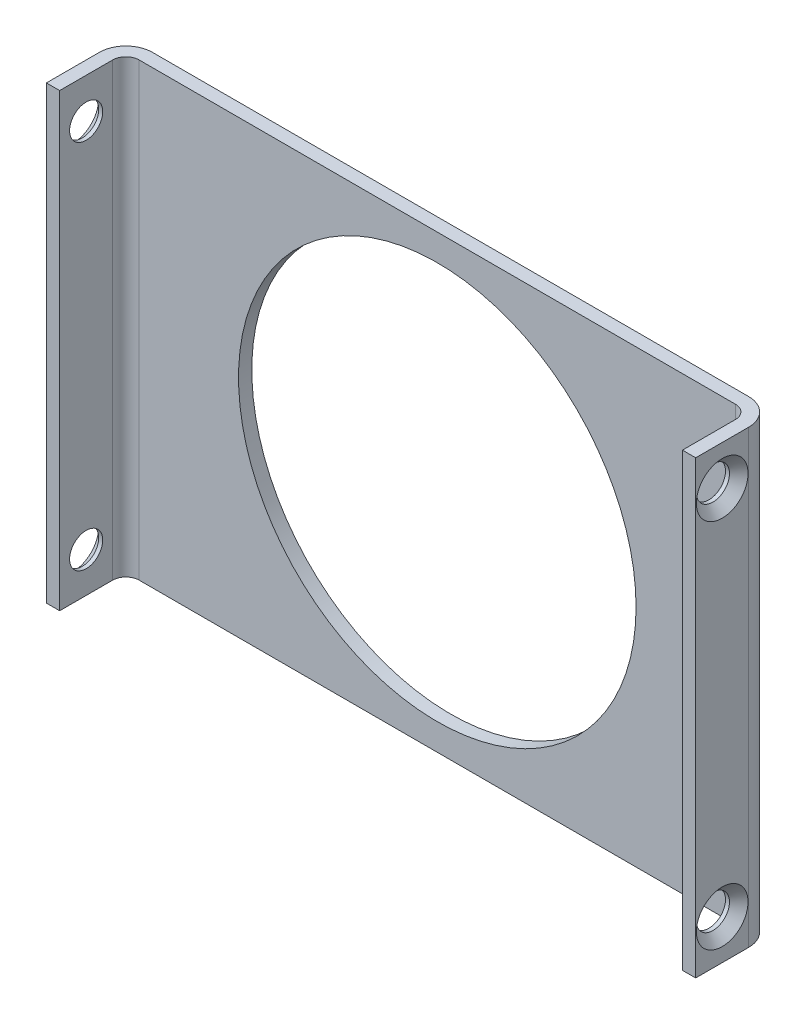
ISO-10303-21;
HEADER;
FILE_DESCRIPTION(('STEP AP214'),'2;1');
FILE_NAME('part.step','',(''),(''),'','','');
FILE_SCHEMA(('AUTOMOTIVE_DESIGN { 1 0 10303 214 1 1 1 1 }'));
ENDSEC;
DATA;
#1=APPLICATION_CONTEXT('core data for automotive mechanical design processes');
#2=APPLICATION_PROTOCOL_DEFINITION('international standard','automotive_design',2000,#1);
#3=PRODUCT_CONTEXT('',#1,'mechanical');
#4=PRODUCT('Part','Part','',(#3));
#5=PRODUCT_RELATED_PRODUCT_CATEGORY('part','',(#4));
#6=PRODUCT_DEFINITION_FORMATION('','',#4);
#7=PRODUCT_DEFINITION_CONTEXT('part definition',#1,'design');
#8=PRODUCT_DEFINITION('design','',#6,#7);
#9=PRODUCT_DEFINITION_SHAPE('','',#8);
#10=(LENGTH_UNIT() NAMED_UNIT(*) SI_UNIT(.MILLI.,.METRE.));
#11=(NAMED_UNIT(*) PLANE_ANGLE_UNIT() SI_UNIT($,.RADIAN.));
#12=(NAMED_UNIT(*) SI_UNIT($,.STERADIAN.) SOLID_ANGLE_UNIT());
#13=UNCERTAINTY_MEASURE_WITH_UNIT(LENGTH_MEASURE(1.E-05),#10,'distance_accuracy_value','');
#14=(GEOMETRIC_REPRESENTATION_CONTEXT(3) GLOBAL_UNCERTAINTY_ASSIGNED_CONTEXT((#13)) GLOBAL_UNIT_ASSIGNED_CONTEXT((#10,
#11,#12)) REPRESENTATION_CONTEXT('',''));
#15=CARTESIAN_POINT('',(0.,0.,0.));
#16=DIRECTION('',(0.,0.,1.));
#17=DIRECTION('',(1.,0.,0.));
#18=AXIS2_PLACEMENT_3D('',#15,#16,#17);
#19=CARTESIAN_POINT('',(0.,0.,2.));
#20=DIRECTION('',(-1.,0.,0.));
#21=DIRECTION('',(0.,-1.,0.));
#22=AXIS2_PLACEMENT_3D('',#19,#20,#21);
#23=PLANE('',#22);
#24=CARTESIAN_POINT('',(0.,62.,7.99999999999998));
#25=DIRECTION('',(-1.,0.,0.));
#26=DIRECTION('',(0.,0.,1.));
#27=AXIS2_PLACEMENT_3D('',#24,#25,#26);
#28=CIRCLE('',#27,3.9);
#29=CARTESIAN_POINT('',(0.,62.,11.9));
#30=VERTEX_POINT('',#29);
#31=EDGE_CURVE('E236',#30,#30,#28,.T.);
#32=ORIENTED_EDGE('',*,*,#31,.F.);
#33=EDGE_LOOP('',(#32));
#34=FACE_BOUND('',#33,.T.);
#35=DIRECTION('',(0.,0.,-1.));
#36=VECTOR('',#35,1.);
#37=CARTESIAN_POINT('',(0.,68.,2.));
#38=LINE('',#37,#36);
#39=CARTESIAN_POINT('',(0.,68.,12.));
#40=VERTEX_POINT('',#39);
#41=CARTESIAN_POINT('',(0.,68.,4.));
#42=VERTEX_POINT('',#41);
#43=EDGE_CURVE('E124',#40,#42,#38,.T.);
#44=ORIENTED_EDGE('',*,*,#43,.T.);
#45=DIRECTION('',(0.,1.,0.));
#46=VECTOR('',#45,1.);
#47=CARTESIAN_POINT('',(0.,68.,4.));
#48=LINE('',#47,#46);
#49=CARTESIAN_POINT('',(0.,0.,4.));
#50=VERTEX_POINT('',#49);
#51=EDGE_CURVE('E59',#42,#50,#48,.F.);
#52=ORIENTED_EDGE('',*,*,#51,.T.);
#53=DIRECTION('',(0.,0.,-1.));
#54=VECTOR('',#53,1.);
#55=CARTESIAN_POINT('',(0.,0.,2.));
#56=LINE('',#55,#54);
#57=CARTESIAN_POINT('',(0.,0.,12.));
#58=VERTEX_POINT('',#57);
#59=EDGE_CURVE('E144',#58,#50,#56,.T.);
#60=ORIENTED_EDGE('',*,*,#59,.F.);
#61=DIRECTION('',(0.,1.,0.));
#62=VECTOR('',#61,1.);
#63=CARTESIAN_POINT('',(0.,0.,12.));
#64=LINE('',#63,#62);
#65=EDGE_CURVE('E139',#58,#40,#64,.T.);
#66=ORIENTED_EDGE('',*,*,#65,.T.);
#67=EDGE_LOOP('',(#44,#52,#60,#66));
#68=FACE_BOUND('',#67,.T.);
#69=CARTESIAN_POINT('',(0.,6.,7.99999999999998));
#70=DIRECTION('',(-1.,0.,0.));
#71=DIRECTION('',(0.,0.,1.));
#72=AXIS2_PLACEMENT_3D('',#69,#70,#71);
#73=CIRCLE('',#72,3.9);
#74=CARTESIAN_POINT('',(0.,6.,11.9));
#75=VERTEX_POINT('',#74);
#76=EDGE_CURVE('E438',#75,#75,#73,.T.);
#77=ORIENTED_EDGE('',*,*,#76,.F.);
#78=EDGE_LOOP('',(#77));
#79=FACE_BOUND('',#78,.T.);
#80=ADVANCED_FACE('F35',(#34,#68,#79),#23,.T.);
#81=CARTESIAN_POINT('',(2.,68.,12.));
#82=DIRECTION('',(1.,0.,0.));
#83=DIRECTION('',(0.,0.,-1.));
#84=AXIS2_PLACEMENT_3D('',#81,#82,#83);
#85=PLANE('',#84);
#86=CARTESIAN_POINT('',(2.,62.,7.99999999999998));
#87=DIRECTION('',(1.,0.,0.));
#88=DIRECTION('',(0.,0.,-1.));
#89=AXIS2_PLACEMENT_3D('',#86,#87,#88);
#90=CIRCLE('',#89,2.5);
#91=CARTESIAN_POINT('',(2.,62.,5.49999999999998));
#92=VERTEX_POINT('',#91);
#93=EDGE_CURVE('E233',#92,#92,#90,.F.);
#94=ORIENTED_EDGE('',*,*,#93,.T.);
#95=EDGE_LOOP('',(#94));
#96=FACE_BOUND('',#95,.T.);
#97=DIRECTION('',(0.,0.,-1.));
#98=VECTOR('',#97,1.);
#99=CARTESIAN_POINT('',(2.,0.,12.));
#100=LINE('',#99,#98);
#101=CARTESIAN_POINT('',(2.,0.,12.));
#102=VERTEX_POINT('',#101);
#103=CARTESIAN_POINT('',(2.,0.,3.99999999999996));
#104=VERTEX_POINT('',#103);
#105=EDGE_CURVE('E158',#102,#104,#100,.T.);
#106=ORIENTED_EDGE('',*,*,#105,.T.);
#107=DIRECTION('',(0.,1.,0.));
#108=VECTOR('',#107,1.);
#109=CARTESIAN_POINT('',(2.,68.,3.99999999999996));
#110=LINE('',#109,#108);
#111=CARTESIAN_POINT('',(2.,68.,3.99999999999996));
#112=VERTEX_POINT('',#111);
#113=EDGE_CURVE('E195',#104,#112,#110,.T.);
#114=ORIENTED_EDGE('',*,*,#113,.T.);
#115=DIRECTION('',(0.,0.,-1.));
#116=VECTOR('',#115,1.);
#117=CARTESIAN_POINT('',(2.,68.,12.));
#118=LINE('',#117,#116);
#119=CARTESIAN_POINT('',(2.,68.,12.));
#120=VERTEX_POINT('',#119);
#121=EDGE_CURVE('E157',#120,#112,#118,.T.);
#122=ORIENTED_EDGE('',*,*,#121,.F.);
#123=DIRECTION('',(0.,-1.,0.));
#124=VECTOR('',#123,1.);
#125=CARTESIAN_POINT('',(2.,68.,12.));
#126=LINE('',#125,#124);
#127=EDGE_CURVE('E141',#120,#102,#126,.T.);
#128=ORIENTED_EDGE('',*,*,#127,.T.);
#129=EDGE_LOOP('',(#106,#114,#122,#128));
#130=FACE_BOUND('',#129,.T.);
#131=CARTESIAN_POINT('',(2.,6.,7.99999999999998));
#132=DIRECTION('',(1.,0.,0.));
#133=DIRECTION('',(0.,0.,-1.));
#134=AXIS2_PLACEMENT_3D('',#131,#132,#133);
#135=CIRCLE('',#134,2.5);
#136=CARTESIAN_POINT('',(2.,6.,5.49999999999998));
#137=VERTEX_POINT('',#136);
#138=EDGE_CURVE('E38',#137,#137,#135,.F.);
#139=ORIENTED_EDGE('',*,*,#138,.T.);
#140=EDGE_LOOP('',(#139));
#141=FACE_BOUND('',#140,.T.);
#142=ADVANCED_FACE('F274',(#96,#130,#141),#85,.T.);
#143=CARTESIAN_POINT('',(98.,68.,2.));
#144=DIRECTION('',(1.,0.,0.));
#145=DIRECTION('',(0.,1.,0.));
#146=AXIS2_PLACEMENT_3D('',#143,#144,#145);
#147=PLANE('',#146);
#148=CARTESIAN_POINT('',(98.,6.,7.99999999999998));
#149=DIRECTION('',(1.,0.,0.));
#150=DIRECTION('',(0.,0.,-1.));
#151=AXIS2_PLACEMENT_3D('',#148,#149,#150);
#152=CIRCLE('',#151,3.9);
#153=CARTESIAN_POINT('',(98.,6.,4.09999999999998));
#154=VERTEX_POINT('',#153);
#155=EDGE_CURVE('E231',#154,#154,#152,.T.);
#156=ORIENTED_EDGE('',*,*,#155,.F.);
#157=EDGE_LOOP('',(#156));
#158=FACE_BOUND('',#157,.T.);
#159=DIRECTION('',(0.,0.,-1.));
#160=VECTOR('',#159,1.);
#161=CARTESIAN_POINT('',(98.,0.,2.));
#162=LINE('',#161,#160);
#163=CARTESIAN_POINT('',(98.,0.,12.));
#164=VERTEX_POINT('',#163);
#165=CARTESIAN_POINT('',(98.,0.,4.));
#166=VERTEX_POINT('',#165);
#167=EDGE_CURVE('E196',#164,#166,#162,.T.);
#168=ORIENTED_EDGE('',*,*,#167,.T.);
#169=DIRECTION('',(0.,-1.,0.));
#170=VECTOR('',#169,1.);
#171=CARTESIAN_POINT('',(98.,68.,4.));
#172=LINE('',#171,#170);
#173=CARTESIAN_POINT('',(98.,68.,4.));
#174=VERTEX_POINT('',#173);
#175=EDGE_CURVE('E11',#166,#174,#172,.F.);
#176=ORIENTED_EDGE('',*,*,#175,.T.);
#177=DIRECTION('',(0.,0.,-1.));
#178=VECTOR('',#177,1.);
#179=CARTESIAN_POINT('',(98.,68.,2.));
#180=LINE('',#179,#178);
#181=CARTESIAN_POINT('',(98.,68.,12.));
#182=VERTEX_POINT('',#181);
#183=EDGE_CURVE('E133',#182,#174,#180,.T.);
#184=ORIENTED_EDGE('',*,*,#183,.F.);
#185=DIRECTION('',(0.,-1.,0.));
#186=VECTOR('',#185,1.);
#187=CARTESIAN_POINT('',(98.,68.,12.));
#188=LINE('',#187,#186);
#189=EDGE_CURVE('E161',#182,#164,#188,.T.);
#190=ORIENTED_EDGE('',*,*,#189,.T.);
#191=EDGE_LOOP('',(#168,#176,#184,#190));
#192=FACE_BOUND('',#191,.T.);
#193=CARTESIAN_POINT('',(98.,62.,7.99999999999998));
#194=DIRECTION('',(1.,0.,0.));
#195=DIRECTION('',(0.,0.,-1.));
#196=AXIS2_PLACEMENT_3D('',#193,#194,#195);
#197=CIRCLE('',#196,3.9);
#198=CARTESIAN_POINT('',(98.,62.,4.09999999999998));
#199=VERTEX_POINT('',#198);
#200=EDGE_CURVE('E235',#199,#199,#197,.T.);
#201=ORIENTED_EDGE('',*,*,#200,.F.);
#202=EDGE_LOOP('',(#201));
#203=FACE_BOUND('',#202,.T.);
#204=ADVANCED_FACE('F279',(#158,#192,#203),#147,.T.);
#205=CARTESIAN_POINT('',(96.,0.,12.));
#206=DIRECTION('',(-1.,0.,0.));
#207=DIRECTION('',(0.,0.,1.));
#208=AXIS2_PLACEMENT_3D('',#205,#206,#207);
#209=PLANE('',#208);
#210=CARTESIAN_POINT('',(96.,6.,7.99999999999998));
#211=DIRECTION('',(-1.,0.,0.));
#212=DIRECTION('',(0.,0.,1.));
#213=AXIS2_PLACEMENT_3D('',#210,#211,#212);
#214=CIRCLE('',#213,2.49999999999999);
#215=CARTESIAN_POINT('',(96.,6.,10.5));
#216=VERTEX_POINT('',#215);
#217=EDGE_CURVE('E146',#216,#216,#214,.F.);
#218=ORIENTED_EDGE('',*,*,#217,.T.);
#219=EDGE_LOOP('',(#218));
#220=FACE_BOUND('',#219,.T.);
#221=DIRECTION('',(0.,0.,-1.));
#222=VECTOR('',#221,1.);
#223=CARTESIAN_POINT('',(96.,68.,12.));
#224=LINE('',#223,#222);
#225=CARTESIAN_POINT('',(96.,68.,12.));
#226=VERTEX_POINT('',#225);
#227=CARTESIAN_POINT('',(96.,68.,4.));
#228=VERTEX_POINT('',#227);
#229=EDGE_CURVE('E174',#226,#228,#224,.T.);
#230=ORIENTED_EDGE('',*,*,#229,.T.);
#231=DIRECTION('',(0.,-1.,0.));
#232=VECTOR('',#231,1.);
#233=CARTESIAN_POINT('',(96.,0.,4.));
#234=LINE('',#233,#232);
#235=CARTESIAN_POINT('',(96.,0.,4.));
#236=VERTEX_POINT('',#235);
#237=EDGE_CURVE('E206',#228,#236,#234,.T.);
#238=ORIENTED_EDGE('',*,*,#237,.T.);
#239=DIRECTION('',(0.,0.,-1.));
#240=VECTOR('',#239,1.);
#241=CARTESIAN_POINT('',(96.,0.,12.));
#242=LINE('',#241,#240);
#243=CARTESIAN_POINT('',(96.,0.,12.));
#244=VERTEX_POINT('',#243);
#245=EDGE_CURVE('E173',#244,#236,#242,.T.);
#246=ORIENTED_EDGE('',*,*,#245,.F.);
#247=DIRECTION('',(0.,1.,0.));
#248=VECTOR('',#247,1.);
#249=CARTESIAN_POINT('',(96.,0.,12.));
#250=LINE('',#249,#248);
#251=EDGE_CURVE('E168',#244,#226,#250,.T.);
#252=ORIENTED_EDGE('',*,*,#251,.T.);
#253=EDGE_LOOP('',(#230,#238,#246,#252));
#254=FACE_BOUND('',#253,.T.);
#255=CARTESIAN_POINT('',(96.,62.,7.99999999999998));
#256=DIRECTION('',(-1.,0.,0.));
#257=DIRECTION('',(0.,0.,1.));
#258=AXIS2_PLACEMENT_3D('',#255,#256,#257);
#259=CIRCLE('',#258,2.5);
#260=CARTESIAN_POINT('',(96.,62.,10.5));
#261=VERTEX_POINT('',#260);
#262=EDGE_CURVE('E229',#261,#261,#259,.F.);
#263=ORIENTED_EDGE('',*,*,#262,.T.);
#264=EDGE_LOOP('',(#263));
#265=FACE_BOUND('',#264,.T.);
#266=ADVANCED_FACE('F284',(#220,#254,#265),#209,.T.);
#267=CARTESIAN_POINT('',(0.,68.,2.));
#268=DIRECTION('',(0.,0.,1.));
#269=DIRECTION('',(1.,0.,0.));
#270=AXIS2_PLACEMENT_3D('',#267,#268,#269);
#271=PLANE('',#270);
#272=DIRECTION('',(-1.,0.,0.));
#273=VECTOR('',#272,1.);
#274=CARTESIAN_POINT('',(98.,68.,2.));
#275=LINE('',#274,#273);
#276=CARTESIAN_POINT('',(94.,68.,1.99999999999996));
#277=VERTEX_POINT('',#276);
#278=CARTESIAN_POINT('',(4.,68.,1.99999999999996));
#279=VERTEX_POINT('',#278);
#280=EDGE_CURVE('E189',#277,#279,#275,.T.);
#281=ORIENTED_EDGE('',*,*,#280,.T.);
#282=DIRECTION('',(0.,1.,0.));
#283=VECTOR('',#282,1.);
#284=CARTESIAN_POINT('',(4.,68.,1.99999999999996));
#285=LINE('',#284,#283);
#286=CARTESIAN_POINT('',(4.,0.,1.99999999999996));
#287=VERTEX_POINT('',#286);
#288=EDGE_CURVE('E204',#279,#287,#285,.F.);
#289=ORIENTED_EDGE('',*,*,#288,.T.);
#290=DIRECTION('',(1.,0.,0.));
#291=VECTOR('',#290,1.);
#292=CARTESIAN_POINT('',(0.,0.,2.));
#293=LINE('',#292,#291);
#294=CARTESIAN_POINT('',(94.,0.,1.99999999999996));
#295=VERTEX_POINT('',#294);
#296=EDGE_CURVE('E134',#287,#295,#293,.T.);
#297=ORIENTED_EDGE('',*,*,#296,.T.);
#298=DIRECTION('',(0.,-1.,0.));
#299=VECTOR('',#298,1.);
#300=CARTESIAN_POINT('',(94.,0.,1.99999999999996));
#301=LINE('',#300,#299);
#302=EDGE_CURVE('E202',#295,#277,#301,.F.);
#303=ORIENTED_EDGE('',*,*,#302,.T.);
#304=EDGE_LOOP('',(#281,#289,#297,#303));
#305=FACE_BOUND('',#304,.T.);
#306=CARTESIAN_POINT('',(49.,34.,2.));
#307=DIRECTION('',(0.,0.,1.));
#308=DIRECTION('',(1.,0.,0.));
#309=AXIS2_PLACEMENT_3D('',#306,#307,#308);
#310=CIRCLE('',#309,30.);
#311=CARTESIAN_POINT('',(79.,34.,2.));
#312=VERTEX_POINT('',#311);
#313=EDGE_CURVE('E182',#312,#312,#310,.T.);
#314=ORIENTED_EDGE('',*,*,#313,.F.);
#315=EDGE_LOOP('',(#314));
#316=FACE_BOUND('',#315,.T.);
#317=ADVANCED_FACE('F298',(#305,#316),#271,.T.);
#318=CARTESIAN_POINT('',(0.,68.,0.));
#319=DIRECTION('',(0.,0.,1.));
#320=DIRECTION('',(1.,0.,0.));
#321=AXIS2_PLACEMENT_3D('',#318,#319,#320);
#322=PLANE('',#321);
#323=DIRECTION('',(1.,0.,0.));
#324=VECTOR('',#323,1.);
#325=CARTESIAN_POINT('',(0.,0.,0.));
#326=LINE('',#325,#324);
#327=CARTESIAN_POINT('',(4.,0.,0.));
#328=VERTEX_POINT('',#327);
#329=CARTESIAN_POINT('',(94.,0.,0.));
#330=VERTEX_POINT('',#329);
#331=EDGE_CURVE('E187',#328,#330,#326,.T.);
#332=ORIENTED_EDGE('',*,*,#331,.F.);
#333=DIRECTION('',(0.,1.,0.));
#334=VECTOR('',#333,1.);
#335=CARTESIAN_POINT('',(4.,68.,0.));
#336=LINE('',#335,#334);
#337=CARTESIAN_POINT('',(4.,68.,0.));
#338=VERTEX_POINT('',#337);
#339=EDGE_CURVE('E220',#328,#338,#336,.T.);
#340=ORIENTED_EDGE('',*,*,#339,.T.);
#341=DIRECTION('',(-1.,0.,0.));
#342=VECTOR('',#341,1.);
#343=CARTESIAN_POINT('',(98.,68.,0.));
#344=LINE('',#343,#342);
#345=CARTESIAN_POINT('',(94.,68.,0.));
#346=VERTEX_POINT('',#345);
#347=EDGE_CURVE('E185',#346,#338,#344,.T.);
#348=ORIENTED_EDGE('',*,*,#347,.F.);
#349=DIRECTION('',(0.,-1.,0.));
#350=VECTOR('',#349,1.);
#351=CARTESIAN_POINT('',(94.,68.,0.));
#352=LINE('',#351,#350);
#353=EDGE_CURVE('E217',#346,#330,#352,.T.);
#354=ORIENTED_EDGE('',*,*,#353,.T.);
#355=EDGE_LOOP('',(#332,#340,#348,#354));
#356=FACE_BOUND('',#355,.T.);
#357=CARTESIAN_POINT('',(49.,34.,0.));
#358=DIRECTION('',(0.,0.,1.));
#359=DIRECTION('',(1.,0.,0.));
#360=AXIS2_PLACEMENT_3D('',#357,#358,#359);
#361=CIRCLE('',#360,30.);
#362=CARTESIAN_POINT('',(79.,34.,0.));
#363=VERTEX_POINT('',#362);
#364=EDGE_CURVE('E177',#363,#363,#361,.T.);
#365=ORIENTED_EDGE('',*,*,#364,.T.);
#366=EDGE_LOOP('',(#365));
#367=FACE_BOUND('',#366,.T.);
#368=ADVANCED_FACE('F303',(#356,#367),#322,.F.);
#369=CARTESIAN_POINT('',(0.,0.,2.));
#370=DIRECTION('',(0.,1.,0.));
#371=DIRECTION('',(0.,0.,1.));
#372=AXIS2_PLACEMENT_3D('',#369,#370,#371);
#373=PLANE('',#372);
#374=ORIENTED_EDGE('',*,*,#59,.T.);
#375=CARTESIAN_POINT('',(4.,0.,3.99999999999996));
#376=DIRECTION('',(0.,1.,0.));
#377=DIRECTION('',(0.,0.,1.));
#378=AXIS2_PLACEMENT_3D('',#375,#376,#377);
#379=CIRCLE('',#378,4.);
#380=EDGE_CURVE('E43',#50,#328,#379,.F.);
#381=ORIENTED_EDGE('',*,*,#380,.T.);
#382=ORIENTED_EDGE('',*,*,#331,.T.);
#383=CARTESIAN_POINT('',(94.,0.,3.99999999999996));
#384=DIRECTION('',(0.,1.,0.));
#385=DIRECTION('',(0.,0.,1.));
#386=AXIS2_PLACEMENT_3D('',#383,#384,#385);
#387=CIRCLE('',#386,4.);
#388=EDGE_CURVE('E51',#330,#166,#387,.F.);
#389=ORIENTED_EDGE('',*,*,#388,.T.);
#390=ORIENTED_EDGE('',*,*,#167,.F.);
#391=DIRECTION('',(1.,0.,0.));
#392=VECTOR('',#391,1.);
#393=CARTESIAN_POINT('',(96.,0.,12.));
#394=LINE('',#393,#392);
#395=EDGE_CURVE('E165',#244,#164,#394,.T.);
#396=ORIENTED_EDGE('',*,*,#395,.F.);
#397=ORIENTED_EDGE('',*,*,#245,.T.);
#398=CARTESIAN_POINT('',(94.,0.,3.99999999999996));
#399=DIRECTION('',(0.,1.,0.));
#400=DIRECTION('',(0.,0.,1.));
#401=AXIS2_PLACEMENT_3D('',#398,#399,#400);
#402=CIRCLE('',#401,2.);
#403=EDGE_CURVE('E213',#236,#295,#402,.T.);
#404=ORIENTED_EDGE('',*,*,#403,.T.);
#405=ORIENTED_EDGE('',*,*,#296,.F.);
#406=CARTESIAN_POINT('',(4.,0.,3.99999999999996));
#407=DIRECTION('',(0.,1.,0.));
#408=DIRECTION('',(0.,0.,1.));
#409=AXIS2_PLACEMENT_3D('',#406,#407,#408);
#410=CIRCLE('',#409,2.);
#411=EDGE_CURVE('E211',#287,#104,#410,.T.);
#412=ORIENTED_EDGE('',*,*,#411,.T.);
#413=ORIENTED_EDGE('',*,*,#105,.F.);
#414=DIRECTION('',(1.,0.,0.));
#415=VECTOR('',#414,1.);
#416=CARTESIAN_POINT('',(0.,0.,12.));
#417=LINE('',#416,#415);
#418=EDGE_CURVE('E155',#58,#102,#417,.T.);
#419=ORIENTED_EDGE('',*,*,#418,.F.);
#420=EDGE_LOOP('',(#374,#381,#382,#389,#390,#396,#397,#404,#405,#412,#413,#419));
#421=FACE_BOUND('',#420,.T.);
#422=ADVANCED_FACE('F306',(#421),#373,.F.);
#423=CARTESIAN_POINT('',(98.,68.,2.));
#424=DIRECTION('',(0.,-1.,0.));
#425=DIRECTION('',(0.,0.,-1.));
#426=AXIS2_PLACEMENT_3D('',#423,#424,#425);
#427=PLANE('',#426);
#428=ORIENTED_EDGE('',*,*,#347,.T.);
#429=CARTESIAN_POINT('',(4.,68.,3.99999999999996));
#430=DIRECTION('',(0.,-1.,0.));
#431=DIRECTION('',(0.,0.,-1.));
#432=AXIS2_PLACEMENT_3D('',#429,#430,#431);
#433=CIRCLE('',#432,4.);
#434=EDGE_CURVE('E131',#338,#42,#433,.F.);
#435=ORIENTED_EDGE('',*,*,#434,.T.);
#436=ORIENTED_EDGE('',*,*,#43,.F.);
#437=DIRECTION('',(-1.,0.,0.));
#438=VECTOR('',#437,1.);
#439=CARTESIAN_POINT('',(2.,68.,12.));
#440=LINE('',#439,#438);
#441=EDGE_CURVE('E129',#120,#40,#440,.T.);
#442=ORIENTED_EDGE('',*,*,#441,.F.);
#443=ORIENTED_EDGE('',*,*,#121,.T.);
#444=CARTESIAN_POINT('',(4.,68.,3.99999999999996));
#445=DIRECTION('',(0.,-1.,0.));
#446=DIRECTION('',(0.,0.,-1.));
#447=AXIS2_PLACEMENT_3D('',#444,#445,#446);
#448=CIRCLE('',#447,2.);
#449=EDGE_CURVE('E209',#112,#279,#448,.T.);
#450=ORIENTED_EDGE('',*,*,#449,.T.);
#451=ORIENTED_EDGE('',*,*,#280,.F.);
#452=CARTESIAN_POINT('',(94.,68.,3.99999999999996));
#453=DIRECTION('',(0.,-1.,0.));
#454=DIRECTION('',(0.,0.,-1.));
#455=AXIS2_PLACEMENT_3D('',#452,#453,#454);
#456=CIRCLE('',#455,2.);
#457=EDGE_CURVE('E215',#277,#228,#456,.T.);
#458=ORIENTED_EDGE('',*,*,#457,.T.);
#459=ORIENTED_EDGE('',*,*,#229,.F.);
#460=DIRECTION('',(-1.,0.,0.));
#461=VECTOR('',#460,1.);
#462=CARTESIAN_POINT('',(98.,68.,12.));
#463=LINE('',#462,#461);
#464=EDGE_CURVE('E171',#182,#226,#463,.T.);
#465=ORIENTED_EDGE('',*,*,#464,.F.);
#466=ORIENTED_EDGE('',*,*,#183,.T.);
#467=CARTESIAN_POINT('',(94.,68.,3.99999999999996));
#468=DIRECTION('',(0.,-1.,0.));
#469=DIRECTION('',(0.,0.,-1.));
#470=AXIS2_PLACEMENT_3D('',#467,#468,#469);
#471=CIRCLE('',#470,4.);
#472=EDGE_CURVE('E223',#174,#346,#471,.F.);
#473=ORIENTED_EDGE('',*,*,#472,.T.);
#474=EDGE_LOOP('',(#428,#435,#436,#442,#443,#450,#451,#458,#459,#465,#466,#473));
#475=FACE_BOUND('',#474,.T.);
#476=ADVANCED_FACE('F127',(#475),#427,.F.);
#477=CARTESIAN_POINT('',(49.,34.,2.));
#478=DIRECTION('',(0.,0.,-1.));
#479=DIRECTION('',(-1.,0.,0.));
#480=AXIS2_PLACEMENT_3D('',#477,#478,#479);
#481=CYLINDRICAL_SURFACE('',#480,30.);
#482=ORIENTED_EDGE('',*,*,#313,.T.);
#483=EDGE_LOOP('',(#482));
#484=FACE_BOUND('',#483,.T.);
#485=ORIENTED_EDGE('',*,*,#364,.F.);
#486=EDGE_LOOP('',(#485));
#487=FACE_BOUND('',#486,.T.);
#488=ADVANCED_FACE('F294',(#484,#487),#481,.F.);
#489=CARTESIAN_POINT('',(98.,0.,12.));
#490=DIRECTION('',(0.,0.,1.));
#491=DIRECTION('',(1.,0.,0.));
#492=AXIS2_PLACEMENT_3D('',#489,#490,#491);
#493=PLANE('',#492);
#494=ORIENTED_EDGE('',*,*,#189,.F.);
#495=ORIENTED_EDGE('',*,*,#464,.T.);
#496=ORIENTED_EDGE('',*,*,#251,.F.);
#497=ORIENTED_EDGE('',*,*,#395,.T.);
#498=EDGE_LOOP('',(#494,#495,#496,#497));
#499=FACE_BOUND('',#498,.T.);
#500=ADVANCED_FACE('F291',(#499),#493,.T.);
#501=CARTESIAN_POINT('',(0.,68.,12.));
#502=DIRECTION('',(0.,0.,1.));
#503=DIRECTION('',(1.,0.,0.));
#504=AXIS2_PLACEMENT_3D('',#501,#502,#503);
#505=PLANE('',#504);
#506=ORIENTED_EDGE('',*,*,#65,.F.);
#507=ORIENTED_EDGE('',*,*,#418,.T.);
#508=ORIENTED_EDGE('',*,*,#127,.F.);
#509=ORIENTED_EDGE('',*,*,#441,.T.);
#510=EDGE_LOOP('',(#506,#507,#508,#509));
#511=FACE_BOUND('',#510,.T.);
#512=ADVANCED_FACE('F138',(#511),#505,.T.);
#513=CARTESIAN_POINT('',(4.,68.,3.99999999999996));
#514=DIRECTION('',(0.,-1.,0.));
#515=DIRECTION('',(0.,0.,-1.));
#516=AXIS2_PLACEMENT_3D('',#513,#514,#515);
#517=CYLINDRICAL_SURFACE('',#516,2.);
#518=ORIENTED_EDGE('',*,*,#411,.F.);
#519=ORIENTED_EDGE('',*,*,#288,.F.);
#520=ORIENTED_EDGE('',*,*,#449,.F.);
#521=ORIENTED_EDGE('',*,*,#113,.F.);
#522=EDGE_LOOP('',(#518,#519,#520,#521));
#523=FACE_BOUND('',#522,.T.);
#524=ADVANCED_FACE('F334',(#523),#517,.F.);
#525=CARTESIAN_POINT('',(94.,0.,3.99999999999996));
#526=DIRECTION('',(0.,1.,0.));
#527=DIRECTION('',(0.,0.,1.));
#528=AXIS2_PLACEMENT_3D('',#525,#526,#527);
#529=CYLINDRICAL_SURFACE('',#528,2.);
#530=ORIENTED_EDGE('',*,*,#457,.F.);
#531=ORIENTED_EDGE('',*,*,#302,.F.);
#532=ORIENTED_EDGE('',*,*,#403,.F.);
#533=ORIENTED_EDGE('',*,*,#237,.F.);
#534=EDGE_LOOP('',(#530,#531,#532,#533));
#535=FACE_BOUND('',#534,.T.);
#536=ADVANCED_FACE('F340',(#535),#529,.F.);
#537=CARTESIAN_POINT('',(4.,68.,3.99999999999996));
#538=DIRECTION('',(0.,-1.,0.));
#539=DIRECTION('',(1.,0.,0.));
#540=AXIS2_PLACEMENT_3D('',#537,#538,#539);
#541=CYLINDRICAL_SURFACE('',#540,4.);
#542=ORIENTED_EDGE('',*,*,#380,.F.);
#543=ORIENTED_EDGE('',*,*,#51,.F.);
#544=ORIENTED_EDGE('',*,*,#434,.F.);
#545=ORIENTED_EDGE('',*,*,#339,.F.);
#546=EDGE_LOOP('',(#542,#543,#544,#545));
#547=FACE_BOUND('',#546,.T.);
#548=ADVANCED_FACE('F347',(#547),#541,.T.);
#549=CARTESIAN_POINT('',(94.,68.,3.99999999999996));
#550=DIRECTION('',(0.,1.,0.));
#551=DIRECTION('',(-1.,0.,0.));
#552=AXIS2_PLACEMENT_3D('',#549,#550,#551);
#553=CYLINDRICAL_SURFACE('',#552,4.);
#554=ORIENTED_EDGE('',*,*,#472,.F.);
#555=ORIENTED_EDGE('',*,*,#175,.F.);
#556=ORIENTED_EDGE('',*,*,#388,.F.);
#557=ORIENTED_EDGE('',*,*,#353,.F.);
#558=EDGE_LOOP('',(#554,#555,#556,#557));
#559=FACE_BOUND('',#558,.T.);
#560=ADVANCED_FACE('F270',(#559),#553,.T.);
#561=CARTESIAN_POINT('',(98.,6.,7.99999999999998));
#562=DIRECTION('',(1.,0.,0.));
#563=DIRECTION('',(0.,0.,-1.));
#564=AXIS2_PLACEMENT_3D('',#561,#562,#563);
#565=CYLINDRICAL_SURFACE('',#564,2.49999999999999);
#566=ORIENTED_EDGE('',*,*,#217,.F.);
#567=EDGE_LOOP('',(#566));
#568=FACE_BOUND('',#567,.T.);
#569=CARTESIAN_POINT('',(96.6,6.,7.99999999999998));
#570=DIRECTION('',(1.,0.,0.));
#571=DIRECTION('',(0.,0.,-1.));
#572=AXIS2_PLACEMENT_3D('',#569,#570,#571);
#573=CIRCLE('',#572,2.49999999999999);
#574=CARTESIAN_POINT('',(96.6,6.,5.49999999999999));
#575=VERTEX_POINT('',#574);
#576=EDGE_CURVE('E149',#575,#575,#573,.T.);
#577=ORIENTED_EDGE('',*,*,#576,.T.);
#578=EDGE_LOOP('',(#577));
#579=FACE_BOUND('',#578,.T.);
#580=ADVANCED_FACE('F257',(#568,#579),#565,.F.);
#581=CARTESIAN_POINT('',(96.6,6.,7.99999999999998));
#582=DIRECTION('',(1.,0.,0.));
#583=DIRECTION('',(0.,0.,-1.));
#584=AXIS2_PLACEMENT_3D('',#581,#582,#583);
#585=CONICAL_SURFACE('',#584,2.49999999999999,0.785398163397448);
#586=ORIENTED_EDGE('',*,*,#155,.T.);
#587=EDGE_LOOP('',(#586));
#588=FACE_BOUND('',#587,.T.);
#589=ORIENTED_EDGE('',*,*,#576,.F.);
#590=EDGE_LOOP('',(#589));
#591=FACE_BOUND('',#590,.T.);
#592=ADVANCED_FACE('F259',(#588,#591),#585,.F.);
#593=CARTESIAN_POINT('',(98.,62.,7.99999999999998));
#594=DIRECTION('',(1.,0.,0.));
#595=DIRECTION('',(0.,0.,-1.));
#596=AXIS2_PLACEMENT_3D('',#593,#594,#595);
#597=CYLINDRICAL_SURFACE('',#596,2.5);
#598=ORIENTED_EDGE('',*,*,#262,.F.);
#599=EDGE_LOOP('',(#598));
#600=FACE_BOUND('',#599,.T.);
#601=CARTESIAN_POINT('',(96.6,62.,7.99999999999998));
#602=DIRECTION('',(1.,0.,0.));
#603=DIRECTION('',(0.,0.,-1.));
#604=AXIS2_PLACEMENT_3D('',#601,#602,#603);
#605=CIRCLE('',#604,2.49999999999999);
#606=CARTESIAN_POINT('',(96.6,62.,5.49999999999999));
#607=VERTEX_POINT('',#606);
#608=EDGE_CURVE('E232',#607,#607,#605,.T.);
#609=ORIENTED_EDGE('',*,*,#608,.T.);
#610=EDGE_LOOP('',(#609));
#611=FACE_BOUND('',#610,.T.);
#612=ADVANCED_FACE('F261',(#600,#611),#597,.F.);
#613=CARTESIAN_POINT('',(96.6,62.,7.99999999999998));
#614=DIRECTION('',(1.,0.,0.));
#615=DIRECTION('',(0.,0.,-1.));
#616=AXIS2_PLACEMENT_3D('',#613,#614,#615);
#617=CONICAL_SURFACE('',#616,2.49999999999999,0.785398163397448);
#618=ORIENTED_EDGE('',*,*,#200,.T.);
#619=EDGE_LOOP('',(#618));
#620=FACE_BOUND('',#619,.T.);
#621=ORIENTED_EDGE('',*,*,#608,.F.);
#622=EDGE_LOOP('',(#621));
#623=FACE_BOUND('',#622,.T.);
#624=ADVANCED_FACE('F267',(#620,#623),#617,.F.);
#625=CARTESIAN_POINT('',(1.4,62.,7.99999999999998));
#626=DIRECTION('',(-1.,0.,0.));
#627=DIRECTION('',(0.,0.,1.));
#628=AXIS2_PLACEMENT_3D('',#625,#626,#627);
#629=CONICAL_SURFACE('',#628,2.5,0.785398163397451);
#630=ORIENTED_EDGE('',*,*,#31,.T.);
#631=EDGE_LOOP('',(#630));
#632=FACE_BOUND('',#631,.T.);
#633=CARTESIAN_POINT('',(1.4,62.,7.99999999999998));
#634=DIRECTION('',(-1.,0.,0.));
#635=DIRECTION('',(0.,0.,1.));
#636=AXIS2_PLACEMENT_3D('',#633,#634,#635);
#637=CIRCLE('',#636,2.5);
#638=CARTESIAN_POINT('',(1.4,62.,10.5));
#639=VERTEX_POINT('',#638);
#640=EDGE_CURVE('E242',#639,#639,#637,.T.);
#641=ORIENTED_EDGE('',*,*,#640,.F.);
#642=EDGE_LOOP('',(#641));
#643=FACE_BOUND('',#642,.T.);
#644=ADVANCED_FACE('F391',(#632,#643),#629,.F.);
#645=CARTESIAN_POINT('',(0.,62.,7.99999999999998));
#646=DIRECTION('',(-1.,0.,0.));
#647=DIRECTION('',(0.,0.,1.));
#648=AXIS2_PLACEMENT_3D('',#645,#646,#647);
#649=CYLINDRICAL_SURFACE('',#648,2.5);
#650=ORIENTED_EDGE('',*,*,#93,.F.);
#651=EDGE_LOOP('',(#650));
#652=FACE_BOUND('',#651,.T.);
#653=ORIENTED_EDGE('',*,*,#640,.T.);
#654=EDGE_LOOP('',(#653));
#655=FACE_BOUND('',#654,.T.);
#656=ADVANCED_FACE('F399',(#652,#655),#649,.F.);
#657=CARTESIAN_POINT('',(1.39999999999998,6.,7.99999999999998));
#658=DIRECTION('',(-1.,0.,0.));
#659=DIRECTION('',(0.,0.,1.));
#660=AXIS2_PLACEMENT_3D('',#657,#658,#659);
#661=CONICAL_SURFACE('',#660,2.5,0.785398163397453);
#662=ORIENTED_EDGE('',*,*,#76,.T.);
#663=EDGE_LOOP('',(#662));
#664=FACE_BOUND('',#663,.T.);
#665=CARTESIAN_POINT('',(1.39999999999998,6.,7.99999999999998));
#666=DIRECTION('',(-1.,0.,0.));
#667=DIRECTION('',(0.,0.,1.));
#668=AXIS2_PLACEMENT_3D('',#665,#666,#667);
#669=CIRCLE('',#668,2.5);
#670=CARTESIAN_POINT('',(1.39999999999998,6.,10.5));
#671=VERTEX_POINT('',#670);
#672=EDGE_CURVE('E436',#671,#671,#669,.T.);
#673=ORIENTED_EDGE('',*,*,#672,.F.);
#674=EDGE_LOOP('',(#673));
#675=FACE_BOUND('',#674,.T.);
#676=ADVANCED_FACE('F405',(#664,#675),#661,.F.);
#677=CARTESIAN_POINT('',(0.,6.,7.99999999999998));
#678=DIRECTION('',(-1.,0.,0.));
#679=DIRECTION('',(0.,0.,1.));
#680=AXIS2_PLACEMENT_3D('',#677,#678,#679);
#681=CYLINDRICAL_SURFACE('',#680,2.5);
#682=ORIENTED_EDGE('',*,*,#138,.F.);
#683=EDGE_LOOP('',(#682));
#684=FACE_BOUND('',#683,.T.);
#685=ORIENTED_EDGE('',*,*,#672,.T.);
#686=EDGE_LOOP('',(#685));
#687=FACE_BOUND('',#686,.T.);
#688=ADVANCED_FACE('F421',(#684,#687),#681,.F.);
#689=CLOSED_SHELL('',(#80,#142,#204,#266,#317,#368,#422,#476,#488,#500,#512,#524,#536,#548,#560,
#580,#592,#612,#624,#644,#656,#676,#688));
#690=MANIFOLD_SOLID_BREP('B2',#689);
#691=ADVANCED_BREP_SHAPE_REPRESENTATION('',(#18,#690),#14);
#692=SHAPE_DEFINITION_REPRESENTATION(#9,#691);
ENDSEC;
END-ISO-10303-21;
